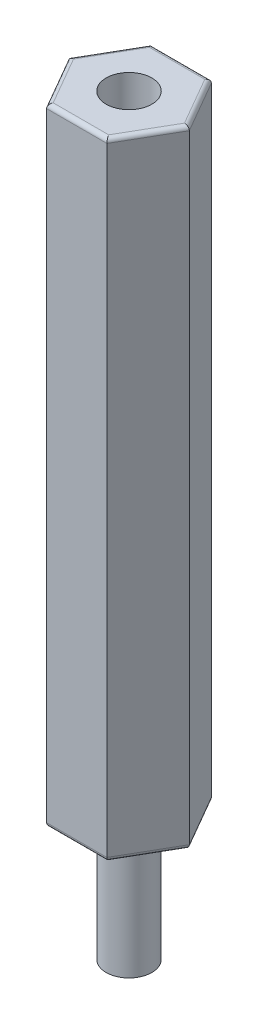
ISO-10303-21;
HEADER;
FILE_DESCRIPTION(('STEP AP214'),'2;1');
FILE_NAME('part.step','',(''),(''),'','','');
FILE_SCHEMA(('AUTOMOTIVE_DESIGN { 1 0 10303 214 1 1 1 1 }'));
ENDSEC;
DATA;
#1=APPLICATION_CONTEXT('core data for automotive mechanical design processes');
#2=APPLICATION_PROTOCOL_DEFINITION('international standard','automotive_design',2000,#1);
#3=PRODUCT_CONTEXT('',#1,'mechanical');
#4=PRODUCT('Part','Part','',(#3));
#5=PRODUCT_RELATED_PRODUCT_CATEGORY('part','',(#4));
#6=PRODUCT_DEFINITION_FORMATION('','',#4);
#7=PRODUCT_DEFINITION_CONTEXT('part definition',#1,'design');
#8=PRODUCT_DEFINITION('design','',#6,#7);
#9=PRODUCT_DEFINITION_SHAPE('','',#8);
#10=(LENGTH_UNIT() NAMED_UNIT(*) SI_UNIT(.MILLI.,.METRE.));
#11=(NAMED_UNIT(*) PLANE_ANGLE_UNIT() SI_UNIT($,.RADIAN.));
#12=(NAMED_UNIT(*) SI_UNIT($,.STERADIAN.) SOLID_ANGLE_UNIT());
#13=UNCERTAINTY_MEASURE_WITH_UNIT(LENGTH_MEASURE(1.E-05),#10,'distance_accuracy_value','');
#14=(GEOMETRIC_REPRESENTATION_CONTEXT(3) GLOBAL_UNCERTAINTY_ASSIGNED_CONTEXT((#13)) GLOBAL_UNIT_ASSIGNED_CONTEXT((#10,
#11,#12)) REPRESENTATION_CONTEXT('',''));
#15=CARTESIAN_POINT('',(0.,0.,0.));
#16=DIRECTION('',(0.,0.,1.));
#17=DIRECTION('',(1.,0.,0.));
#18=AXIS2_PLACEMENT_3D('',#15,#16,#17);
#19=CARTESIAN_POINT('',(2.88675134594813,0.,0.));
#20=DIRECTION('',(0.,1.,0.));
#21=DIRECTION('',(0.,0.,1.));
#22=AXIS2_PLACEMENT_3D('',#19,#20,#21);
#23=PLANE('',#22);
#24=DIRECTION('',(0.5,0.,-0.866025403784439));
#25=VECTOR('',#24,1.);
#26=CARTESIAN_POINT('',(2.71354626519124,0.,-0.100000000000001));
#27=LINE('',#26,#25);
#28=CARTESIAN_POINT('',(2.65581123827228,0.,0.));
#29=VERTEX_POINT('',#28);
#30=CARTESIAN_POINT('',(1.32790561913614,0.,2.3));
#31=VERTEX_POINT('',#30);
#32=EDGE_CURVE('E188',#29,#31,#27,.F.);
#33=ORIENTED_EDGE('',*,*,#32,.T.);
#34=DIRECTION('',(1.,0.,0.));
#35=VECTOR('',#34,1.);
#36=CARTESIAN_POINT('',(2.88675134594813,0.,2.3));
#37=LINE('',#36,#35);
#38=CARTESIAN_POINT('',(-1.32790561913614,0.,2.3));
#39=VERTEX_POINT('',#38);
#40=EDGE_CURVE('E41',#31,#39,#37,.F.);
#41=ORIENTED_EDGE('',*,*,#40,.T.);
#42=DIRECTION('',(0.5,0.,0.866025403784439));
#43=VECTOR('',#42,1.);
#44=CARTESIAN_POINT('',(-1.27017059221718,0.,2.4));
#45=LINE('',#44,#43);
#46=CARTESIAN_POINT('',(-2.65581123827228,0.,0.));
#47=VERTEX_POINT('',#46);
#48=EDGE_CURVE('E55',#39,#47,#45,.F.);
#49=ORIENTED_EDGE('',*,*,#48,.T.);
#50=DIRECTION('',(-0.5,0.,0.866025403784439));
#51=VECTOR('',#50,1.);
#52=CARTESIAN_POINT('',(-1.27017059221718,0.,-2.4));
#53=LINE('',#52,#51);
#54=CARTESIAN_POINT('',(-1.32790561913614,0.,-2.3));
#55=VERTEX_POINT('',#54);
#56=EDGE_CURVE('E194',#47,#55,#53,.F.);
#57=ORIENTED_EDGE('',*,*,#56,.T.);
#58=DIRECTION('',(-1.,0.,0.));
#59=VECTOR('',#58,1.);
#60=CARTESIAN_POINT('',(2.88675134594813,0.,-2.3));
#61=LINE('',#60,#59);
#62=CARTESIAN_POINT('',(1.32790561913614,0.,-2.3));
#63=VERTEX_POINT('',#62);
#64=EDGE_CURVE('E192',#55,#63,#61,.F.);
#65=ORIENTED_EDGE('',*,*,#64,.T.);
#66=DIRECTION('',(-0.5,0.,-0.866025403784439));
#67=VECTOR('',#66,1.);
#68=CARTESIAN_POINT('',(2.71354626519124,0.,0.0999999999999995));
#69=LINE('',#68,#67);
#70=EDGE_CURVE('E190',#63,#29,#69,.F.);
#71=ORIENTED_EDGE('',*,*,#70,.T.);
#72=EDGE_LOOP('',(#33,#41,#49,#57,#65,#71));
#73=FACE_BOUND('',#72,.T.);
#74=CARTESIAN_POINT('',(0.,0.,0.));
#75=DIRECTION('',(0.,1.,0.));
#76=DIRECTION('',(0.,0.,1.));
#77=AXIS2_PLACEMENT_3D('',#74,#75,#76);
#78=CIRCLE('',#77,1.0922);
#79=CARTESIAN_POINT('',(0.,0.,1.0922));
#80=VERTEX_POINT('',#79);
#81=EDGE_CURVE('E11',#80,#80,#78,.F.);
#82=ORIENTED_EDGE('',*,*,#81,.F.);
#83=EDGE_LOOP('',(#82));
#84=FACE_BOUND('',#83,.T.);
#85=ADVANCED_FACE('F33',(#73,#84),#23,.F.);
#86=CARTESIAN_POINT('',(1.44337567297406,30.,2.5));
#87=DIRECTION('',(-0.866025403784439,0.,-0.5));
#88=DIRECTION('',(-0.5,0.,0.866025403784439));
#89=AXIS2_PLACEMENT_3D('',#86,#87,#88);
#90=PLANE('',#89);
#91=DIRECTION('',(0.,-1.,0.));
#92=VECTOR('',#91,1.);
#93=CARTESIAN_POINT('',(2.88675134594813,30.,0.));
#94=LINE('',#93,#92);
#95=CARTESIAN_POINT('',(2.88675134594813,29.8,0.));
#96=VERTEX_POINT('',#95);
#97=CARTESIAN_POINT('',(2.88675134594813,0.199999999999999,0.));
#98=VERTEX_POINT('',#97);
#99=EDGE_CURVE('E149',#96,#98,#94,.T.);
#100=ORIENTED_EDGE('',*,*,#99,.F.);
#101=DIRECTION('',(0.5,0.,-0.866025403784439));
#102=VECTOR('',#101,1.);
#103=CARTESIAN_POINT('',(1.44337567297406,29.8,2.5));
#104=LINE('',#103,#102);
#105=CARTESIAN_POINT('',(1.44337567297406,29.8,2.5));
#106=VERTEX_POINT('',#105);
#107=EDGE_CURVE('E140',#96,#106,#104,.F.);
#108=ORIENTED_EDGE('',*,*,#107,.T.);
#109=DIRECTION('',(0.,-1.,0.));
#110=VECTOR('',#109,1.);
#111=CARTESIAN_POINT('',(1.44337567297406,30.,2.5));
#112=LINE('',#111,#110);
#113=CARTESIAN_POINT('',(1.44337567297406,0.199999999999999,2.5));
#114=VERTEX_POINT('',#113);
#115=EDGE_CURVE('E208',#106,#114,#112,.T.);
#116=ORIENTED_EDGE('',*,*,#115,.T.);
#117=DIRECTION('',(0.5,0.,-0.866025403784439));
#118=VECTOR('',#117,1.);
#119=CARTESIAN_POINT('',(1.44337567297406,0.199999999999999,2.5));
#120=LINE('',#119,#118);
#121=EDGE_CURVE('E181',#114,#98,#120,.T.);
#122=ORIENTED_EDGE('',*,*,#121,.T.);
#123=EDGE_LOOP('',(#100,#108,#116,#122));
#124=FACE_BOUND('',#123,.T.);
#125=ADVANCED_FACE('F253',(#124),#90,.F.);
#126=CARTESIAN_POINT('',(2.88675134594813,30.,0.));
#127=DIRECTION('',(-0.866025403784439,0.,0.5));
#128=DIRECTION('',(0.5,0.,0.866025403784439));
#129=AXIS2_PLACEMENT_3D('',#126,#127,#128);
#130=PLANE('',#129);
#131=DIRECTION('',(0.,-1.,0.));
#132=VECTOR('',#131,1.);
#133=CARTESIAN_POINT('',(1.44337567297406,30.,-2.5));
#134=LINE('',#133,#132);
#135=CARTESIAN_POINT('',(1.44337567297406,29.8,-2.5));
#136=VERTEX_POINT('',#135);
#137=CARTESIAN_POINT('',(1.44337567297406,0.199999999999999,-2.5));
#138=VERTEX_POINT('',#137);
#139=EDGE_CURVE('E152',#136,#138,#134,.T.);
#140=ORIENTED_EDGE('',*,*,#139,.F.);
#141=DIRECTION('',(-0.5,0.,-0.866025403784439));
#142=VECTOR('',#141,1.);
#143=CARTESIAN_POINT('',(2.88675134594813,29.8,0.));
#144=LINE('',#143,#142);
#145=EDGE_CURVE('E186',#136,#96,#144,.F.);
#146=ORIENTED_EDGE('',*,*,#145,.T.);
#147=ORIENTED_EDGE('',*,*,#99,.T.);
#148=DIRECTION('',(-0.5,0.,-0.866025403784439));
#149=VECTOR('',#148,1.);
#150=CARTESIAN_POINT('',(2.88675134594813,0.199999999999999,0.));
#151=LINE('',#150,#149);
#152=EDGE_CURVE('E184',#98,#138,#151,.T.);
#153=ORIENTED_EDGE('',*,*,#152,.T.);
#154=EDGE_LOOP('',(#140,#146,#147,#153));
#155=FACE_BOUND('',#154,.T.);
#156=ADVANCED_FACE('F271',(#155),#130,.F.);
#157=CARTESIAN_POINT('',(1.44337567297406,30.,-2.5));
#158=DIRECTION('',(0.,0.,1.));
#159=DIRECTION('',(1.,0.,0.));
#160=AXIS2_PLACEMENT_3D('',#157,#158,#159);
#161=PLANE('',#160);
#162=DIRECTION('',(0.,-1.,0.));
#163=VECTOR('',#162,1.);
#164=CARTESIAN_POINT('',(-1.44337567297406,30.,-2.5));
#165=LINE('',#164,#163);
#166=CARTESIAN_POINT('',(-1.44337567297406,29.8,-2.5));
#167=VERTEX_POINT('',#166);
#168=CARTESIAN_POINT('',(-1.44337567297406,0.199999999999999,-2.5));
#169=VERTEX_POINT('',#168);
#170=EDGE_CURVE('E262',#167,#169,#165,.T.);
#171=ORIENTED_EDGE('',*,*,#170,.F.);
#172=DIRECTION('',(-1.,0.,0.));
#173=VECTOR('',#172,1.);
#174=CARTESIAN_POINT('',(1.44337567297406,29.8,-2.5));
#175=LINE('',#174,#173);
#176=EDGE_CURVE('E165',#167,#136,#175,.F.);
#177=ORIENTED_EDGE('',*,*,#176,.T.);
#178=ORIENTED_EDGE('',*,*,#139,.T.);
#179=DIRECTION('',(-1.,0.,0.));
#180=VECTOR('',#179,1.);
#181=CARTESIAN_POINT('',(1.44337567297406,0.199999999999999,-2.5));
#182=LINE('',#181,#180);
#183=EDGE_CURVE('E163',#138,#169,#182,.T.);
#184=ORIENTED_EDGE('',*,*,#183,.T.);
#185=EDGE_LOOP('',(#171,#177,#178,#184));
#186=FACE_BOUND('',#185,.T.);
#187=ADVANCED_FACE('F268',(#186),#161,.F.);
#188=CARTESIAN_POINT('',(-1.44337567297406,30.,-2.5));
#189=DIRECTION('',(0.866025403784439,0.,0.5));
#190=DIRECTION('',(0.5,0.,-0.866025403784439));
#191=AXIS2_PLACEMENT_3D('',#188,#189,#190);
#192=PLANE('',#191);
#193=DIRECTION('',(0.,-1.,0.));
#194=VECTOR('',#193,1.);
#195=CARTESIAN_POINT('',(-2.88675134594813,30.,0.));
#196=LINE('',#195,#194);
#197=CARTESIAN_POINT('',(-2.88675134594813,29.8,0.));
#198=VERTEX_POINT('',#197);
#199=CARTESIAN_POINT('',(-2.88675134594813,0.199999999999999,0.));
#200=VERTEX_POINT('',#199);
#201=EDGE_CURVE('E255',#198,#200,#196,.T.);
#202=ORIENTED_EDGE('',*,*,#201,.F.);
#203=DIRECTION('',(-0.5,0.,0.866025403784439));
#204=VECTOR('',#203,1.);
#205=CARTESIAN_POINT('',(-1.44337567297406,29.8,-2.5));
#206=LINE('',#205,#204);
#207=EDGE_CURVE('E170',#198,#167,#206,.F.);
#208=ORIENTED_EDGE('',*,*,#207,.T.);
#209=ORIENTED_EDGE('',*,*,#170,.T.);
#210=DIRECTION('',(-0.5,0.,0.866025403784439));
#211=VECTOR('',#210,1.);
#212=CARTESIAN_POINT('',(-1.44337567297406,0.199999999999999,-2.5));
#213=LINE('',#212,#211);
#214=EDGE_CURVE('E168',#169,#200,#213,.T.);
#215=ORIENTED_EDGE('',*,*,#214,.T.);
#216=EDGE_LOOP('',(#202,#208,#209,#215));
#217=FACE_BOUND('',#216,.T.);
#218=ADVANCED_FACE('F278',(#217),#192,.F.);
#219=CARTESIAN_POINT('',(-2.88675134594813,30.,0.));
#220=DIRECTION('',(0.866025403784439,0.,-0.5));
#221=DIRECTION('',(-0.5,0.,-0.866025403784439));
#222=AXIS2_PLACEMENT_3D('',#219,#220,#221);
#223=PLANE('',#222);
#224=DIRECTION('',(0.,-1.,0.));
#225=VECTOR('',#224,1.);
#226=CARTESIAN_POINT('',(-1.44337567297406,30.,2.5));
#227=LINE('',#226,#225);
#228=CARTESIAN_POINT('',(-1.44337567297406,29.8,2.5));
#229=VERTEX_POINT('',#228);
#230=CARTESIAN_POINT('',(-1.44337567297406,0.199999999999999,2.5));
#231=VERTEX_POINT('',#230);
#232=EDGE_CURVE('E250',#229,#231,#227,.T.);
#233=ORIENTED_EDGE('',*,*,#232,.F.);
#234=DIRECTION('',(0.5,0.,0.866025403784439));
#235=VECTOR('',#234,1.);
#236=CARTESIAN_POINT('',(-2.88675134594813,29.8,0.));
#237=LINE('',#236,#235);
#238=EDGE_CURVE('E174',#229,#198,#237,.F.);
#239=ORIENTED_EDGE('',*,*,#238,.T.);
#240=ORIENTED_EDGE('',*,*,#201,.T.);
#241=DIRECTION('',(0.5,0.,0.866025403784439));
#242=VECTOR('',#241,1.);
#243=CARTESIAN_POINT('',(-2.88675134594813,0.199999999999999,0.));
#244=LINE('',#243,#242);
#245=EDGE_CURVE('E172',#200,#231,#244,.T.);
#246=ORIENTED_EDGE('',*,*,#245,.T.);
#247=EDGE_LOOP('',(#233,#239,#240,#246));
#248=FACE_BOUND('',#247,.T.);
#249=ADVANCED_FACE('F290',(#248),#223,.F.);
#250=CARTESIAN_POINT('',(-1.44337567297406,30.,2.5));
#251=DIRECTION('',(0.,0.,-1.));
#252=DIRECTION('',(-1.,0.,0.));
#253=AXIS2_PLACEMENT_3D('',#250,#251,#252);
#254=PLANE('',#253);
#255=ORIENTED_EDGE('',*,*,#115,.F.);
#256=DIRECTION('',(1.,0.,0.));
#257=VECTOR('',#256,1.);
#258=CARTESIAN_POINT('',(-1.44337567297406,29.8,2.5));
#259=LINE('',#258,#257);
#260=EDGE_CURVE('E179',#106,#229,#259,.F.);
#261=ORIENTED_EDGE('',*,*,#260,.T.);
#262=ORIENTED_EDGE('',*,*,#232,.T.);
#263=DIRECTION('',(1.,0.,0.));
#264=VECTOR('',#263,1.);
#265=CARTESIAN_POINT('',(-1.44337567297406,0.199999999999999,2.5));
#266=LINE('',#265,#264);
#267=EDGE_CURVE('E176',#231,#114,#266,.T.);
#268=ORIENTED_EDGE('',*,*,#267,.T.);
#269=EDGE_LOOP('',(#255,#261,#262,#268));
#270=FACE_BOUND('',#269,.T.);
#271=ADVANCED_FACE('F247',(#270),#254,.F.);
#272=CARTESIAN_POINT('',(2.88675134594813,30.,0.));
#273=DIRECTION('',(0.,1.,0.));
#274=DIRECTION('',(0.,0.,1.));
#275=AXIS2_PLACEMENT_3D('',#272,#273,#274);
#276=PLANE('',#275);
#277=CARTESIAN_POINT('',(0.,30.,0.));
#278=DIRECTION('',(0.,1.,0.));
#279=DIRECTION('',(0.,0.,1.));
#280=AXIS2_PLACEMENT_3D('',#277,#278,#279);
#281=CIRCLE('',#280,1.0922);
#282=CARTESIAN_POINT('',(0.,30.,1.0922));
#283=VERTEX_POINT('',#282);
#284=EDGE_CURVE('E373',#283,#283,#281,.T.);
#285=ORIENTED_EDGE('',*,*,#284,.F.);
#286=EDGE_LOOP('',(#285));
#287=FACE_BOUND('',#286,.T.);
#288=DIRECTION('',(-0.5,0.,-0.866025403784439));
#289=VECTOR('',#288,1.);
#290=CARTESIAN_POINT('',(1.27017059221718,30.,-2.4));
#291=LINE('',#290,#289);
#292=CARTESIAN_POINT('',(2.65581123827228,30.,0.));
#293=VERTEX_POINT('',#292);
#294=CARTESIAN_POINT('',(1.32790561913614,30.,-2.3));
#295=VERTEX_POINT('',#294);
#296=EDGE_CURVE('E128',#293,#295,#291,.T.);
#297=ORIENTED_EDGE('',*,*,#296,.T.);
#298=DIRECTION('',(-1.,0.,0.));
#299=VECTOR('',#298,1.);
#300=CARTESIAN_POINT('',(-1.44337567297406,30.,-2.3));
#301=LINE('',#300,#299);
#302=CARTESIAN_POINT('',(-1.32790561913614,30.,-2.3));
#303=VERTEX_POINT('',#302);
#304=EDGE_CURVE('E161',#295,#303,#301,.T.);
#305=ORIENTED_EDGE('',*,*,#304,.T.);
#306=DIRECTION('',(-0.5,0.,0.866025403784439));
#307=VECTOR('',#306,1.);
#308=CARTESIAN_POINT('',(-2.71354626519124,30.,0.100000000000001));
#309=LINE('',#308,#307);
#310=CARTESIAN_POINT('',(-2.65581123827228,30.,0.));
#311=VERTEX_POINT('',#310);
#312=EDGE_CURVE('E159',#303,#311,#309,.T.);
#313=ORIENTED_EDGE('',*,*,#312,.T.);
#314=DIRECTION('',(0.5,0.,0.866025403784439));
#315=VECTOR('',#314,1.);
#316=CARTESIAN_POINT('',(-1.27017059221718,30.,2.4));
#317=LINE('',#316,#315);
#318=CARTESIAN_POINT('',(-1.32790561913614,30.,2.3));
#319=VERTEX_POINT('',#318);
#320=EDGE_CURVE('E157',#311,#319,#317,.T.);
#321=ORIENTED_EDGE('',*,*,#320,.T.);
#322=DIRECTION('',(1.,0.,0.));
#323=VECTOR('',#322,1.);
#324=CARTESIAN_POINT('',(1.44337567297406,30.,2.3));
#325=LINE('',#324,#323);
#326=CARTESIAN_POINT('',(1.32790561913614,30.,2.3));
#327=VERTEX_POINT('',#326);
#328=EDGE_CURVE('E131',#319,#327,#325,.T.);
#329=ORIENTED_EDGE('',*,*,#328,.T.);
#330=DIRECTION('',(0.5,0.,-0.866025403784439));
#331=VECTOR('',#330,1.);
#332=CARTESIAN_POINT('',(2.71354626519124,30.,-0.100000000000001));
#333=LINE('',#332,#331);
#334=EDGE_CURVE('E123',#327,#293,#333,.T.);
#335=ORIENTED_EDGE('',*,*,#334,.T.);
#336=EDGE_LOOP('',(#297,#305,#313,#321,#329,#335));
#337=FACE_BOUND('',#336,.T.);
#338=ADVANCED_FACE('F125',(#287,#337),#276,.T.);
#339=CARTESIAN_POINT('',(2.88675134594813,29.8,2.3));
#340=DIRECTION('',(-1.,0.,0.));
#341=DIRECTION('',(0.,0.,1.));
#342=AXIS2_PLACEMENT_3D('',#339,#340,#341);
#343=CYLINDRICAL_SURFACE('',#342,0.2);
#344=CARTESIAN_POINT('',(-1.32790561913614,29.8,2.3));
#345=DIRECTION('',(-0.866025403784439,0.,-0.5));
#346=DIRECTION('',(-0.5,0.,0.866025403784439));
#347=AXIS2_PLACEMENT_3D('',#344,#345,#346);
#348=ELLIPSE('',#347,0.23094010767585,0.2);
#349=EDGE_CURVE('E143',#229,#319,#348,.T.);
#350=ORIENTED_EDGE('',*,*,#349,.F.);
#351=ORIENTED_EDGE('',*,*,#260,.F.);
#352=CARTESIAN_POINT('',(1.32790561913614,29.8,2.3));
#353=DIRECTION('',(-0.866025403784438,0.,0.5));
#354=DIRECTION('',(0.5,0.,0.866025403784439));
#355=AXIS2_PLACEMENT_3D('',#352,#353,#354);
#356=ELLIPSE('',#355,0.23094010767585,0.2);
#357=EDGE_CURVE('E206',#327,#106,#356,.F.);
#358=ORIENTED_EDGE('',*,*,#357,.F.);
#359=ORIENTED_EDGE('',*,*,#328,.F.);
#360=EDGE_LOOP('',(#350,#351,#358,#359));
#361=FACE_BOUND('',#360,.T.);
#362=ADVANCED_FACE('F313',(#361),#343,.T.);
#363=CARTESIAN_POINT('',(2.71354626519124,29.8,-0.100000000000001));
#364=DIRECTION('',(-0.5,0.,0.866025403784439));
#365=DIRECTION('',(0.866025403784439,0.,0.5));
#366=AXIS2_PLACEMENT_3D('',#363,#364,#365);
#367=CYLINDRICAL_SURFACE('',#366,0.2);
#368=ORIENTED_EDGE('',*,*,#357,.T.);
#369=ORIENTED_EDGE('',*,*,#107,.F.);
#370=CARTESIAN_POINT('',(2.65581123827228,29.8,0.));
#371=DIRECTION('',(0.,0.,1.));
#372=DIRECTION('',(1.,0.,0.));
#373=AXIS2_PLACEMENT_3D('',#370,#371,#372);
#374=ELLIPSE('',#373,0.23094010767585,0.2);
#375=EDGE_CURVE('E138',#293,#96,#374,.F.);
#376=ORIENTED_EDGE('',*,*,#375,.F.);
#377=ORIENTED_EDGE('',*,*,#334,.F.);
#378=EDGE_LOOP('',(#368,#369,#376,#377));
#379=FACE_BOUND('',#378,.T.);
#380=ADVANCED_FACE('F139',(#379),#367,.T.);
#381=CARTESIAN_POINT('',(-1.27017059221718,29.8,2.4));
#382=DIRECTION('',(-0.5,0.,-0.866025403784439));
#383=DIRECTION('',(-0.866025403784439,0.,0.5));
#384=AXIS2_PLACEMENT_3D('',#381,#382,#383);
#385=CYLINDRICAL_SURFACE('',#384,0.2);
#386=ORIENTED_EDGE('',*,*,#349,.T.);
#387=ORIENTED_EDGE('',*,*,#320,.F.);
#388=CARTESIAN_POINT('',(-2.65581123827228,29.8,0.));
#389=DIRECTION('',(0.,0.,-1.));
#390=DIRECTION('',(-1.,0.,0.));
#391=AXIS2_PLACEMENT_3D('',#388,#389,#390);
#392=ELLIPSE('',#391,0.23094010767585,0.2);
#393=EDGE_CURVE('E144',#198,#311,#392,.T.);
#394=ORIENTED_EDGE('',*,*,#393,.F.);
#395=ORIENTED_EDGE('',*,*,#238,.F.);
#396=EDGE_LOOP('',(#386,#387,#394,#395));
#397=FACE_BOUND('',#396,.T.);
#398=ADVANCED_FACE('F304',(#397),#385,.T.);
#399=CARTESIAN_POINT('',(2.71354626519124,29.8,0.0999999999999994));
#400=DIRECTION('',(0.5,0.,0.866025403784439));
#401=DIRECTION('',(0.866025403784439,0.,-0.5));
#402=AXIS2_PLACEMENT_3D('',#399,#400,#401);
#403=CYLINDRICAL_SURFACE('',#402,0.2);
#404=ORIENTED_EDGE('',*,*,#375,.T.);
#405=ORIENTED_EDGE('',*,*,#145,.F.);
#406=CARTESIAN_POINT('',(1.32790561913614,29.8,-2.3));
#407=DIRECTION('',(0.866025403784439,0.,0.5));
#408=DIRECTION('',(-0.5,0.,0.866025403784439));
#409=AXIS2_PLACEMENT_3D('',#406,#407,#408);
#410=ELLIPSE('',#409,0.23094010767585,0.2);
#411=EDGE_CURVE('E147',#295,#136,#410,.F.);
#412=ORIENTED_EDGE('',*,*,#411,.F.);
#413=ORIENTED_EDGE('',*,*,#296,.F.);
#414=EDGE_LOOP('',(#404,#405,#412,#413));
#415=FACE_BOUND('',#414,.T.);
#416=ADVANCED_FACE('F146',(#415),#403,.T.);
#417=CARTESIAN_POINT('',(-1.27017059221718,29.8,-2.4));
#418=DIRECTION('',(0.5,0.,-0.866025403784439));
#419=DIRECTION('',(-0.866025403784439,0.,-0.5));
#420=AXIS2_PLACEMENT_3D('',#417,#418,#419);
#421=CYLINDRICAL_SURFACE('',#420,0.2);
#422=ORIENTED_EDGE('',*,*,#393,.T.);
#423=ORIENTED_EDGE('',*,*,#312,.F.);
#424=CARTESIAN_POINT('',(-1.32790561913614,29.8,-2.3));
#425=DIRECTION('',(0.866025403784439,0.,-0.5));
#426=DIRECTION('',(-0.5,0.,-0.866025403784439));
#427=AXIS2_PLACEMENT_3D('',#424,#425,#426);
#428=ELLIPSE('',#427,0.23094010767585,0.2);
#429=EDGE_CURVE('E198',#167,#303,#428,.T.);
#430=ORIENTED_EDGE('',*,*,#429,.F.);
#431=ORIENTED_EDGE('',*,*,#207,.F.);
#432=EDGE_LOOP('',(#422,#423,#430,#431));
#433=FACE_BOUND('',#432,.T.);
#434=ADVANCED_FACE('F308',(#433),#421,.T.);
#435=CARTESIAN_POINT('',(2.88675134594813,29.8,-2.3));
#436=DIRECTION('',(1.,0.,0.));
#437=DIRECTION('',(0.,0.,-1.));
#438=AXIS2_PLACEMENT_3D('',#435,#436,#437);
#439=CYLINDRICAL_SURFACE('',#438,0.2);
#440=ORIENTED_EDGE('',*,*,#411,.T.);
#441=ORIENTED_EDGE('',*,*,#176,.F.);
#442=ORIENTED_EDGE('',*,*,#429,.T.);
#443=ORIENTED_EDGE('',*,*,#304,.F.);
#444=EDGE_LOOP('',(#440,#441,#442,#443));
#445=FACE_BOUND('',#444,.T.);
#446=ADVANCED_FACE('F310',(#445),#439,.T.);
#447=CARTESIAN_POINT('',(1.44337567297406,0.199999999999999,-2.3));
#448=DIRECTION('',(-1.,0.,0.));
#449=DIRECTION('',(0.,0.,1.));
#450=AXIS2_PLACEMENT_3D('',#447,#448,#449);
#451=CYLINDRICAL_SURFACE('',#450,0.2);
#452=CARTESIAN_POINT('',(1.32790561913614,0.199999999999999,-2.3));
#453=DIRECTION('',(-0.866025403784439,0.,-0.5));
#454=DIRECTION('',(0.5,0.,-0.866025403784439));
#455=AXIS2_PLACEMENT_3D('',#452,#453,#454);
#456=ELLIPSE('',#455,0.23094010767585,0.2);
#457=EDGE_CURVE('E219',#63,#138,#456,.F.);
#458=ORIENTED_EDGE('',*,*,#457,.F.);
#459=ORIENTED_EDGE('',*,*,#64,.F.);
#460=CARTESIAN_POINT('',(-1.32790561913614,0.199999999999999,-2.3));
#461=DIRECTION('',(-0.866025403784439,0.,0.5));
#462=DIRECTION('',(-0.5,0.,-0.866025403784439));
#463=AXIS2_PLACEMENT_3D('',#460,#461,#462);
#464=ELLIPSE('',#463,0.23094010767585,0.2);
#465=EDGE_CURVE('E200',#169,#55,#464,.T.);
#466=ORIENTED_EDGE('',*,*,#465,.F.);
#467=ORIENTED_EDGE('',*,*,#183,.F.);
#468=EDGE_LOOP('',(#458,#459,#466,#467));
#469=FACE_BOUND('',#468,.T.);
#470=ADVANCED_FACE('F35',(#469),#451,.T.);
#471=CARTESIAN_POINT('',(-1.27017059221718,0.199999999999999,-2.4));
#472=DIRECTION('',(-0.5,0.,0.866025403784439));
#473=DIRECTION('',(0.866025403784439,0.,0.5));
#474=AXIS2_PLACEMENT_3D('',#471,#472,#473);
#475=CYLINDRICAL_SURFACE('',#474,0.2);
#476=ORIENTED_EDGE('',*,*,#465,.T.);
#477=ORIENTED_EDGE('',*,*,#56,.F.);
#478=CARTESIAN_POINT('',(-2.65581123827228,0.199999999999999,0.));
#479=DIRECTION('',(0.,0.,1.));
#480=DIRECTION('',(-1.,0.,0.));
#481=AXIS2_PLACEMENT_3D('',#478,#479,#480);
#482=ELLIPSE('',#481,0.23094010767585,0.2);
#483=EDGE_CURVE('E216',#200,#47,#482,.T.);
#484=ORIENTED_EDGE('',*,*,#483,.F.);
#485=ORIENTED_EDGE('',*,*,#214,.F.);
#486=EDGE_LOOP('',(#476,#477,#484,#485));
#487=FACE_BOUND('',#486,.T.);
#488=ADVANCED_FACE('F225',(#487),#475,.T.);
#489=CARTESIAN_POINT('',(2.71354626519124,0.199999999999999,0.0999999999999992));
#490=DIRECTION('',(-0.5,0.,-0.866025403784439));
#491=DIRECTION('',(-0.866025403784439,0.,0.5));
#492=AXIS2_PLACEMENT_3D('',#489,#490,#491);
#493=CYLINDRICAL_SURFACE('',#492,0.2);
#494=ORIENTED_EDGE('',*,*,#457,.T.);
#495=ORIENTED_EDGE('',*,*,#152,.F.);
#496=CARTESIAN_POINT('',(2.65581123827228,0.199999999999999,0.));
#497=DIRECTION('',(0.,0.,-1.));
#498=DIRECTION('',(1.,0.,0.));
#499=AXIS2_PLACEMENT_3D('',#496,#497,#498);
#500=ELLIPSE('',#499,0.23094010767585,0.2);
#501=EDGE_CURVE('E213',#29,#98,#500,.F.);
#502=ORIENTED_EDGE('',*,*,#501,.F.);
#503=ORIENTED_EDGE('',*,*,#70,.F.);
#504=EDGE_LOOP('',(#494,#495,#502,#503));
#505=FACE_BOUND('',#504,.T.);
#506=ADVANCED_FACE('F237',(#505),#493,.T.);
#507=CARTESIAN_POINT('',(-2.71354626519124,0.199999999999999,-0.0999999999999996));
#508=DIRECTION('',(0.5,0.,0.866025403784439));
#509=DIRECTION('',(0.866025403784439,0.,-0.5));
#510=AXIS2_PLACEMENT_3D('',#507,#508,#509);
#511=CYLINDRICAL_SURFACE('',#510,0.2);
#512=ORIENTED_EDGE('',*,*,#483,.T.);
#513=ORIENTED_EDGE('',*,*,#48,.F.);
#514=CARTESIAN_POINT('',(-1.32790561913614,0.199999999999999,2.3));
#515=DIRECTION('',(0.866025403784439,0.,0.5));
#516=DIRECTION('',(-0.5,0.,0.866025403784439));
#517=AXIS2_PLACEMENT_3D('',#514,#515,#516);
#518=ELLIPSE('',#517,0.23094010767585,0.2);
#519=EDGE_CURVE('E48',#231,#39,#518,.T.);
#520=ORIENTED_EDGE('',*,*,#519,.F.);
#521=ORIENTED_EDGE('',*,*,#245,.F.);
#522=EDGE_LOOP('',(#512,#513,#520,#521));
#523=FACE_BOUND('',#522,.T.);
#524=ADVANCED_FACE('F316',(#523),#511,.T.);
#525=CARTESIAN_POINT('',(1.27017059221718,0.199999999999999,2.4));
#526=DIRECTION('',(0.5,0.,-0.866025403784439));
#527=DIRECTION('',(-0.866025403784439,0.,-0.5));
#528=AXIS2_PLACEMENT_3D('',#525,#526,#527);
#529=CYLINDRICAL_SURFACE('',#528,0.2);
#530=ORIENTED_EDGE('',*,*,#501,.T.);
#531=ORIENTED_EDGE('',*,*,#121,.F.);
#532=CARTESIAN_POINT('',(1.32790561913614,0.199999999999999,2.3));
#533=DIRECTION('',(0.866025403784438,0.,-0.5));
#534=DIRECTION('',(-0.5,0.,-0.866025403784439));
#535=AXIS2_PLACEMENT_3D('',#532,#533,#534);
#536=ELLIPSE('',#535,0.23094010767585,0.2);
#537=EDGE_CURVE('E209',#31,#114,#536,.F.);
#538=ORIENTED_EDGE('',*,*,#537,.F.);
#539=ORIENTED_EDGE('',*,*,#32,.F.);
#540=EDGE_LOOP('',(#530,#531,#538,#539));
#541=FACE_BOUND('',#540,.T.);
#542=ADVANCED_FACE('F241',(#541),#529,.T.);
#543=CARTESIAN_POINT('',(-1.44337567297406,0.199999999999999,2.3));
#544=DIRECTION('',(1.,0.,0.));
#545=DIRECTION('',(0.,0.,-1.));
#546=AXIS2_PLACEMENT_3D('',#543,#544,#545);
#547=CYLINDRICAL_SURFACE('',#546,0.2);
#548=ORIENTED_EDGE('',*,*,#519,.T.);
#549=ORIENTED_EDGE('',*,*,#40,.F.);
#550=ORIENTED_EDGE('',*,*,#537,.T.);
#551=ORIENTED_EDGE('',*,*,#267,.F.);
#552=EDGE_LOOP('',(#548,#549,#550,#551));
#553=FACE_BOUND('',#552,.T.);
#554=ADVANCED_FACE('F242',(#553),#547,.T.);
#555=CARTESIAN_POINT('',(0.,-6.,0.));
#556=DIRECTION('',(0.,1.,0.));
#557=DIRECTION('',(0.,0.,1.));
#558=AXIS2_PLACEMENT_3D('',#555,#556,#557);
#559=CYLINDRICAL_SURFACE('',#558,1.0922);
#560=CARTESIAN_POINT('',(0.,-6.,0.));
#561=DIRECTION('',(0.,-1.,0.));
#562=DIRECTION('',(0.,0.,-1.));
#563=AXIS2_PLACEMENT_3D('',#560,#561,#562);
#564=CIRCLE('',#563,1.0922);
#565=CARTESIAN_POINT('',(0.,-6.,-1.0922));
#566=VERTEX_POINT('',#565);
#567=EDGE_CURVE('E211',#566,#566,#564,.T.);
#568=ORIENTED_EDGE('',*,*,#567,.F.);
#569=EDGE_LOOP('',(#568));
#570=FACE_BOUND('',#569,.T.);
#571=ORIENTED_EDGE('',*,*,#81,.T.);
#572=EDGE_LOOP('',(#571));
#573=FACE_BOUND('',#572,.T.);
#574=ADVANCED_FACE('F347',(#570,#573),#559,.T.);
#575=CARTESIAN_POINT('',(0.,-6.,0.));
#576=DIRECTION('',(0.,-1.,0.));
#577=DIRECTION('',(0.,0.,-1.));
#578=AXIS2_PLACEMENT_3D('',#575,#576,#577);
#579=PLANE('',#578);
#580=ORIENTED_EDGE('',*,*,#567,.T.);
#581=EDGE_LOOP('',(#580));
#582=FACE_BOUND('',#581,.T.);
#583=ADVANCED_FACE('F351',(#582),#579,.T.);
#584=CARTESIAN_POINT('',(0.,25.24,0.));
#585=DIRECTION('',(0.,1.,0.));
#586=DIRECTION('',(0.,0.,1.));
#587=AXIS2_PLACEMENT_3D('',#584,#585,#586);
#588=CYLINDRICAL_SURFACE('',#587,1.0922);
#589=CARTESIAN_POINT('',(0.,25.24,0.));
#590=DIRECTION('',(0.,1.,0.));
#591=DIRECTION('',(0.,0.,1.));
#592=AXIS2_PLACEMENT_3D('',#589,#590,#591);
#593=CIRCLE('',#592,1.0922);
#594=CARTESIAN_POINT('',(0.,25.24,1.0922));
#595=VERTEX_POINT('',#594);
#596=EDGE_CURVE('E372',#595,#595,#593,.T.);
#597=ORIENTED_EDGE('',*,*,#596,.F.);
#598=EDGE_LOOP('',(#597));
#599=FACE_BOUND('',#598,.T.);
#600=ORIENTED_EDGE('',*,*,#284,.T.);
#601=EDGE_LOOP('',(#600));
#602=FACE_BOUND('',#601,.T.);
#603=ADVANCED_FACE('F356',(#599,#602),#588,.F.);
#604=CARTESIAN_POINT('',(0.,25.24,0.));
#605=DIRECTION('',(0.,1.,0.));
#606=DIRECTION('',(0.,0.,1.));
#607=AXIS2_PLACEMENT_3D('',#604,#605,#606);
#608=PLANE('',#607);
#609=ORIENTED_EDGE('',*,*,#596,.T.);
#610=EDGE_LOOP('',(#609));
#611=FACE_BOUND('',#610,.T.);
#612=ADVANCED_FACE('F364',(#611),#608,.T.);
#613=CLOSED_SHELL('',(#85,#125,#156,#187,#218,#249,#271,#338,#362,#380,#398,#416,#434,#446,#470,
#488,#506,#524,#542,#554,#574,#583,#603,#612));
#614=MANIFOLD_SOLID_BREP('B2',#613);
#615=ADVANCED_BREP_SHAPE_REPRESENTATION('',(#18,#614),#14);
#616=SHAPE_DEFINITION_REPRESENTATION(#9,#615);
ENDSEC;
END-ISO-10303-21;
